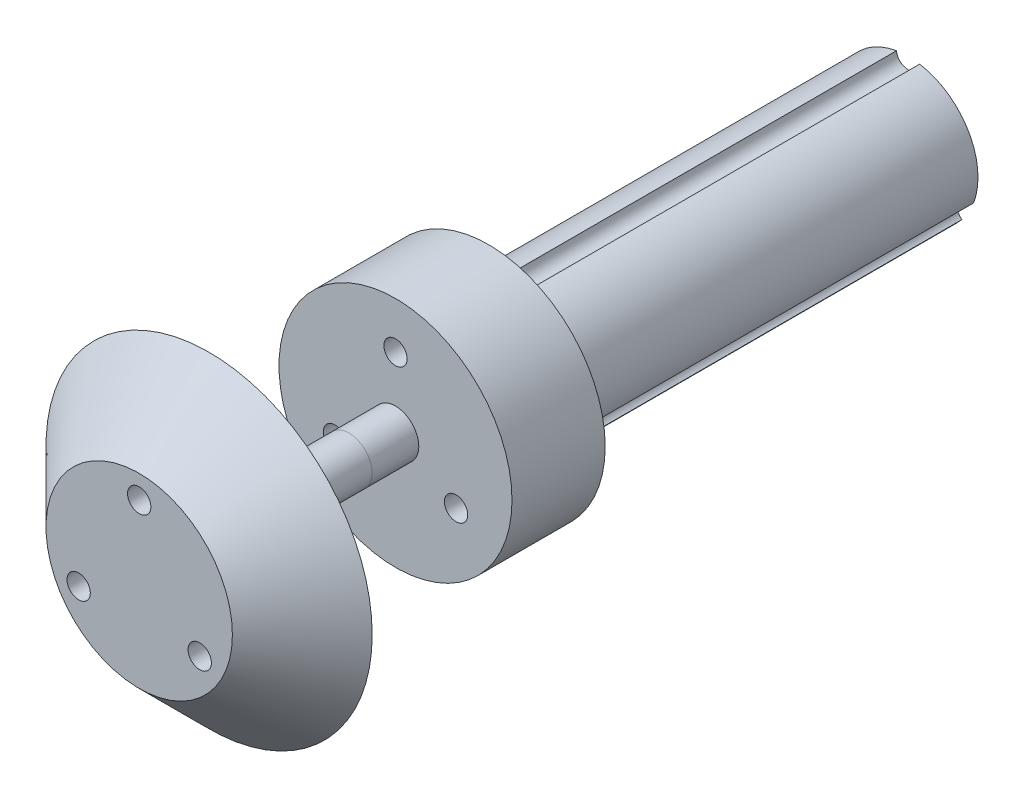
ISO-10303-21;
HEADER;
FILE_DESCRIPTION(('STEP AP214'),'2;1');
FILE_NAME('part.step','',(''),(''),'','','');
FILE_SCHEMA(('AUTOMOTIVE_DESIGN { 1 0 10303 214 1 1 1 1 }'));
ENDSEC;
DATA;
#1=APPLICATION_CONTEXT('core data for automotive mechanical design processes');
#2=APPLICATION_PROTOCOL_DEFINITION('international standard','automotive_design',2000,#1);
#3=PRODUCT_CONTEXT('',#1,'mechanical');
#4=PRODUCT('Part','Part','',(#3));
#5=PRODUCT_RELATED_PRODUCT_CATEGORY('part','',(#4));
#6=PRODUCT_DEFINITION_FORMATION('','',#4);
#7=PRODUCT_DEFINITION_CONTEXT('part definition',#1,'design');
#8=PRODUCT_DEFINITION('design','',#6,#7);
#9=PRODUCT_DEFINITION_SHAPE('','',#8);
#10=(LENGTH_UNIT() NAMED_UNIT(*) SI_UNIT(.MILLI.,.METRE.));
#11=(NAMED_UNIT(*) PLANE_ANGLE_UNIT() SI_UNIT($,.RADIAN.));
#12=(NAMED_UNIT(*) SI_UNIT($,.STERADIAN.) SOLID_ANGLE_UNIT());
#13=UNCERTAINTY_MEASURE_WITH_UNIT(LENGTH_MEASURE(1.E-05),#10,'distance_accuracy_value','');
#14=(GEOMETRIC_REPRESENTATION_CONTEXT(3) GLOBAL_UNCERTAINTY_ASSIGNED_CONTEXT((#13)) GLOBAL_UNIT_ASSIGNED_CONTEXT((#10,
#11,#12)) REPRESENTATION_CONTEXT('',''));
#15=CARTESIAN_POINT('',(0.,0.,0.));
#16=DIRECTION('',(0.,0.,1.));
#17=DIRECTION('',(1.,0.,0.));
#18=AXIS2_PLACEMENT_3D('',#15,#16,#17);
#19=CARTESIAN_POINT('',(0.,0.,-10.25));
#20=DIRECTION('',(0.,0.,1.));
#21=DIRECTION('',(1.,0.,0.));
#22=AXIS2_PLACEMENT_3D('',#19,#20,#21);
#23=CYLINDRICAL_SURFACE('',#22,1.5);
#24=DIRECTION('',(0.,0.,1.));
#25=VECTOR('',#24,1.);
#26=CARTESIAN_POINT('',(-0.249130432147946,1.47916666666667,-2.));
#27=LINE('',#26,#25);
#28=CARTESIAN_POINT('',(-0.249130432147946,1.47916666666667,-10.25));
#29=VERTEX_POINT('',#28);
#30=CARTESIAN_POINT('',(-0.249130432147946,1.47916666666667,-1.25));
#31=VERTEX_POINT('',#30);
#32=EDGE_CURVE('E149',#29,#31,#27,.T.);
#33=ORIENTED_EDGE('',*,*,#32,.F.);
#34=CARTESIAN_POINT('',(0.,0.,-10.25));
#35=DIRECTION('',(0.,0.,1.));
#36=DIRECTION('',(1.,0.,0.));
#37=AXIS2_PLACEMENT_3D('',#34,#35,#36);
#38=CIRCLE('',#37,1.5);
#39=CARTESIAN_POINT('',(-1.40556112583843,-0.523830050237488,-10.25));
#40=VERTEX_POINT('',#39);
#41=EDGE_CURVE('E122',#29,#40,#38,.T.);
#42=ORIENTED_EDGE('',*,*,#41,.T.);
#43=DIRECTION('',(0.,0.,1.));
#44=VECTOR('',#43,1.);
#45=CARTESIAN_POINT('',(-1.40556112583843,-0.523830050237488,-2.));
#46=LINE('',#45,#44);
#47=CARTESIAN_POINT('',(-1.40556112583843,-0.523830050237487,-1.25));
#48=VERTEX_POINT('',#47);
#49=EDGE_CURVE('E75',#48,#40,#46,.F.);
#50=ORIENTED_EDGE('',*,*,#49,.F.);
#51=CARTESIAN_POINT('',(0.,0.,-1.25));
#52=DIRECTION('',(0.,0.,1.));
#53=DIRECTION('',(1.,0.,0.));
#54=AXIS2_PLACEMENT_3D('',#51,#52,#53);
#55=CIRCLE('',#54,1.5);
#56=EDGE_CURVE('E134',#31,#48,#55,.T.);
#57=ORIENTED_EDGE('',*,*,#56,.F.);
#58=EDGE_LOOP('',(#33,#42,#50,#57));
#59=FACE_BOUND('',#58,.T.);
#60=ADVANCED_FACE('F51',(#59),#23,.T.);
#61=DIRECTION('',(0.,0.,1.));
#62=VECTOR('',#61,1.);
#63=CARTESIAN_POINT('',(0.249130432147946,1.47916666666667,-2.));
#64=LINE('',#63,#62);
#65=CARTESIAN_POINT('',(0.249130432147946,1.47916666666667,-1.25));
#66=VERTEX_POINT('',#65);
#67=CARTESIAN_POINT('',(0.249130432147946,1.47916666666667,-10.25));
#68=VERTEX_POINT('',#67);
#69=EDGE_CURVE('E167',#66,#68,#64,.F.);
#70=ORIENTED_EDGE('',*,*,#69,.F.);
#71=CARTESIAN_POINT('',(1.40556112583848,-0.523830050237345,-1.25));
#72=VERTEX_POINT('',#71);
#73=EDGE_CURVE('E125',#72,#66,#55,.T.);
#74=ORIENTED_EDGE('',*,*,#73,.F.);
#75=DIRECTION('',(0.,0.,1.));
#76=VECTOR('',#75,1.);
#77=CARTESIAN_POINT('',(1.40556112583848,-0.523830050237346,-2.));
#78=LINE('',#77,#76);
#79=CARTESIAN_POINT('',(1.40556112583848,-0.523830050237346,-10.25));
#80=VERTEX_POINT('',#79);
#81=EDGE_CURVE('E162',#80,#72,#78,.T.);
#82=ORIENTED_EDGE('',*,*,#81,.F.);
#83=EDGE_CURVE('E123',#80,#68,#38,.T.);
#84=ORIENTED_EDGE('',*,*,#83,.T.);
#85=EDGE_LOOP('',(#70,#74,#82,#84));
#86=FACE_BOUND('',#85,.T.);
#87=ADVANCED_FACE('F187',(#86),#23,.T.);
#88=CARTESIAN_POINT('',(0.,0.,0.749999999999998));
#89=DIRECTION('',(0.,0.,-1.));
#90=DIRECTION('',(-1.,0.,0.));
#91=AXIS2_PLACEMENT_3D('',#88,#89,#90);
#92=CYLINDRICAL_SURFACE('',#91,2.50000000000012);
#93=CARTESIAN_POINT('',(0.,0.,0.749999999999998));
#94=DIRECTION('',(0.,0.,1.));
#95=DIRECTION('',(1.,0.,0.));
#96=AXIS2_PLACEMENT_3D('',#93,#94,#95);
#97=CIRCLE('',#96,2.50000000000012);
#98=CARTESIAN_POINT('',(2.50000000000012,0.,0.749999999999998));
#99=VERTEX_POINT('',#98);
#100=EDGE_CURVE('E60',#99,#99,#97,.T.);
#101=ORIENTED_EDGE('',*,*,#100,.F.);
#102=EDGE_LOOP('',(#101));
#103=FACE_BOUND('',#102,.T.);
#104=CARTESIAN_POINT('',(0.,0.,-1.25));
#105=DIRECTION('',(0.,0.,1.));
#106=DIRECTION('',(1.,0.,0.));
#107=AXIS2_PLACEMENT_3D('',#104,#105,#106);
#108=CIRCLE('',#107,2.50000000000012);
#109=CARTESIAN_POINT('',(2.50000000000012,0.,-1.25));
#110=VERTEX_POINT('',#109);
#111=EDGE_CURVE('E131',#110,#110,#108,.T.);
#112=ORIENTED_EDGE('',*,*,#111,.T.);
#113=EDGE_LOOP('',(#112));
#114=FACE_BOUND('',#113,.T.);
#115=ADVANCED_FACE('F53',(#103,#114),#92,.T.);
#116=CARTESIAN_POINT('',(0.,0.,0.749999999999998));
#117=DIRECTION('',(0.,0.,1.));
#118=DIRECTION('',(1.,0.,0.));
#119=AXIS2_PLACEMENT_3D('',#116,#117,#118);
#120=PLANE('',#119);
#121=CARTESIAN_POINT('',(0.,0.,0.749999999999999));
#122=DIRECTION('',(0.,0.,1.));
#123=DIRECTION('',(1.,0.,0.));
#124=AXIS2_PLACEMENT_3D('',#121,#122,#123);
#125=CIRCLE('',#124,0.5);
#126=CARTESIAN_POINT('',(0.5,0.,0.749999999999999));
#127=VERTEX_POINT('',#126);
#128=EDGE_CURVE('E55',#127,#127,#125,.F.);
#129=ORIENTED_EDGE('',*,*,#128,.T.);
#130=EDGE_LOOP('',(#129));
#131=FACE_BOUND('',#130,.T.);
#132=CARTESIAN_POINT('',(0.,1.5,0.749999999999999));
#133=DIRECTION('',(0.,0.,1.));
#134=DIRECTION('',(1.,0.,0.));
#135=AXIS2_PLACEMENT_3D('',#132,#133,#134);
#136=CIRCLE('',#135,0.25);
#137=CARTESIAN_POINT('',(0.25,1.5,0.749999999999999));
#138=VERTEX_POINT('',#137);
#139=EDGE_CURVE('E127',#138,#138,#136,.T.);
#140=ORIENTED_EDGE('',*,*,#139,.F.);
#141=EDGE_LOOP('',(#140));
#142=FACE_BOUND('',#141,.T.);
#143=CARTESIAN_POINT('',(1.29903810567674,-0.749999999999954,0.749999999999999));
#144=DIRECTION('',(0.,0.,1.));
#145=DIRECTION('',(1.,0.,0.));
#146=AXIS2_PLACEMENT_3D('',#143,#144,#145);
#147=CIRCLE('',#146,0.25);
#148=CARTESIAN_POINT('',(1.54903810567674,-0.749999999999954,0.749999999999999));
#149=VERTEX_POINT('',#148);
#150=EDGE_CURVE('E164',#149,#149,#147,.T.);
#151=ORIENTED_EDGE('',*,*,#150,.F.);
#152=EDGE_LOOP('',(#151));
#153=FACE_BOUND('',#152,.T.);
#154=CARTESIAN_POINT('',(-1.29903810567658,-0.750000000000046,0.749999999999999));
#155=DIRECTION('',(0.,0.,1.));
#156=DIRECTION('',(1.,0.,0.));
#157=AXIS2_PLACEMENT_3D('',#154,#155,#156);
#158=CIRCLE('',#157,0.25);
#159=CARTESIAN_POINT('',(-1.04903810567658,-0.750000000000046,0.749999999999999));
#160=VERTEX_POINT('',#159);
#161=EDGE_CURVE('E116',#160,#160,#158,.T.);
#162=ORIENTED_EDGE('',*,*,#161,.F.);
#163=EDGE_LOOP('',(#162));
#164=FACE_BOUND('',#163,.T.);
#165=ORIENTED_EDGE('',*,*,#100,.T.);
#166=EDGE_LOOP('',(#165));
#167=FACE_BOUND('',#166,.T.);
#168=ADVANCED_FACE('F175',(#131,#142,#153,#164,#167),#120,.T.);
#169=CARTESIAN_POINT('',(0.,0.,-1.25));
#170=DIRECTION('',(0.,0.,1.));
#171=DIRECTION('',(1.,0.,0.));
#172=AXIS2_PLACEMENT_3D('',#169,#170,#171);
#173=PLANE('',#172);
#174=ORIENTED_EDGE('',*,*,#73,.T.);
#175=CARTESIAN_POINT('',(0.,1.5,-1.25));
#176=DIRECTION('',(0.,0.,1.));
#177=DIRECTION('',(1.,0.,0.));
#178=AXIS2_PLACEMENT_3D('',#175,#176,#177);
#179=CIRCLE('',#178,0.25);
#180=EDGE_CURVE('E146',#66,#31,#179,.T.);
#181=ORIENTED_EDGE('',*,*,#180,.T.);
#182=ORIENTED_EDGE('',*,*,#56,.T.);
#183=CARTESIAN_POINT('',(-1.29903810567658,-0.750000000000046,-1.25));
#184=DIRECTION('',(0.,0.,1.));
#185=DIRECTION('',(1.,0.,0.));
#186=AXIS2_PLACEMENT_3D('',#183,#184,#185);
#187=CIRCLE('',#186,0.25);
#188=CARTESIAN_POINT('',(-1.15643069369046,-0.955336616429313,-1.25));
#189=VERTEX_POINT('',#188);
#190=EDGE_CURVE('E117',#48,#189,#187,.T.);
#191=ORIENTED_EDGE('',*,*,#190,.T.);
#192=CARTESIAN_POINT('',(1.15643069369056,-0.955336616429186,-1.25));
#193=VERTEX_POINT('',#192);
#194=EDGE_CURVE('E115',#189,#193,#55,.T.);
#195=ORIENTED_EDGE('',*,*,#194,.T.);
#196=CARTESIAN_POINT('',(1.29903810567674,-0.749999999999954,-1.25));
#197=DIRECTION('',(0.,0.,1.));
#198=DIRECTION('',(1.,0.,0.));
#199=AXIS2_PLACEMENT_3D('',#196,#197,#198);
#200=CIRCLE('',#199,0.25);
#201=EDGE_CURVE('E160',#193,#72,#200,.T.);
#202=ORIENTED_EDGE('',*,*,#201,.T.);
#203=EDGE_LOOP('',(#174,#181,#182,#191,#195,#202));
#204=FACE_BOUND('',#203,.T.);
#205=ORIENTED_EDGE('',*,*,#111,.F.);
#206=EDGE_LOOP('',(#205));
#207=FACE_BOUND('',#206,.T.);
#208=ADVANCED_FACE('F144',(#204,#207),#173,.F.);
#209=DIRECTION('',(0.,0.,1.));
#210=VECTOR('',#209,1.);
#211=CARTESIAN_POINT('',(1.15643069369056,-0.955336616429185,-2.));
#212=LINE('',#211,#210);
#213=CARTESIAN_POINT('',(1.15643069369056,-0.955336616429186,-10.25));
#214=VERTEX_POINT('',#213);
#215=EDGE_CURVE('E67',#193,#214,#212,.F.);
#216=ORIENTED_EDGE('',*,*,#215,.F.);
#217=ORIENTED_EDGE('',*,*,#194,.F.);
#218=DIRECTION('',(0.,0.,1.));
#219=VECTOR('',#218,1.);
#220=CARTESIAN_POINT('',(-1.15643069369046,-0.955336616429314,-2.));
#221=LINE('',#220,#219);
#222=CARTESIAN_POINT('',(-1.15643069369046,-0.955336616429314,-10.25));
#223=VERTEX_POINT('',#222);
#224=EDGE_CURVE('E103',#223,#189,#221,.T.);
#225=ORIENTED_EDGE('',*,*,#224,.F.);
#226=EDGE_CURVE('E113',#223,#214,#38,.T.);
#227=ORIENTED_EDGE('',*,*,#226,.T.);
#228=EDGE_LOOP('',(#216,#217,#225,#227));
#229=FACE_BOUND('',#228,.T.);
#230=ADVANCED_FACE('F112',(#229),#23,.T.);
#231=CARTESIAN_POINT('',(0.,0.,-10.25));
#232=DIRECTION('',(0.,0.,1.));
#233=DIRECTION('',(1.,0.,0.));
#234=AXIS2_PLACEMENT_3D('',#231,#232,#233);
#235=PLANE('',#234);
#236=ORIENTED_EDGE('',*,*,#41,.F.);
#237=CARTESIAN_POINT('',(0.,1.5,-10.25));
#238=DIRECTION('',(0.,0.,1.));
#239=DIRECTION('',(1.,0.,0.));
#240=AXIS2_PLACEMENT_3D('',#237,#238,#239);
#241=CIRCLE('',#240,0.25);
#242=EDGE_CURVE('E150',#29,#68,#241,.T.);
#243=ORIENTED_EDGE('',*,*,#242,.T.);
#244=ORIENTED_EDGE('',*,*,#83,.F.);
#245=CARTESIAN_POINT('',(1.29903810567674,-0.749999999999954,-10.25));
#246=DIRECTION('',(0.,0.,1.));
#247=DIRECTION('',(1.,0.,0.));
#248=AXIS2_PLACEMENT_3D('',#245,#246,#247);
#249=CIRCLE('',#248,0.25);
#250=EDGE_CURVE('E121',#80,#214,#249,.T.);
#251=ORIENTED_EDGE('',*,*,#250,.T.);
#252=ORIENTED_EDGE('',*,*,#226,.F.);
#253=CARTESIAN_POINT('',(-1.29903810567658,-0.750000000000046,-10.25));
#254=DIRECTION('',(0.,0.,1.));
#255=DIRECTION('',(1.,0.,0.));
#256=AXIS2_PLACEMENT_3D('',#253,#254,#255);
#257=CIRCLE('',#256,0.25);
#258=EDGE_CURVE('E12',#223,#40,#257,.T.);
#259=ORIENTED_EDGE('',*,*,#258,.T.);
#260=EDGE_LOOP('',(#236,#243,#244,#251,#252,#259));
#261=FACE_BOUND('',#260,.T.);
#262=ADVANCED_FACE('F119',(#261),#235,.F.);
#263=CARTESIAN_POINT('',(-1.29903810567658,-0.750000000000046,-10.25));
#264=DIRECTION('',(0.,0.,1.));
#265=DIRECTION('',(1.,0.,0.));
#266=AXIS2_PLACEMENT_3D('',#263,#264,#265);
#267=CYLINDRICAL_SURFACE('',#266,0.25);
#268=ORIENTED_EDGE('',*,*,#161,.T.);
#269=EDGE_LOOP('',(#268));
#270=FACE_BOUND('',#269,.T.);
#271=ORIENTED_EDGE('',*,*,#224,.T.);
#272=ORIENTED_EDGE('',*,*,#190,.F.);
#273=ORIENTED_EDGE('',*,*,#49,.T.);
#274=ORIENTED_EDGE('',*,*,#258,.F.);
#275=EDGE_LOOP('',(#271,#272,#273,#274));
#276=FACE_BOUND('',#275,.T.);
#277=ADVANCED_FACE('F102',(#270,#276),#267,.F.);
#278=CARTESIAN_POINT('',(1.29903810567674,-0.749999999999954,-10.25));
#279=DIRECTION('',(0.,0.,1.));
#280=DIRECTION('',(1.,0.,0.));
#281=AXIS2_PLACEMENT_3D('',#278,#279,#280);
#282=CYLINDRICAL_SURFACE('',#281,0.25);
#283=ORIENTED_EDGE('',*,*,#150,.T.);
#284=EDGE_LOOP('',(#283));
#285=FACE_BOUND('',#284,.T.);
#286=ORIENTED_EDGE('',*,*,#81,.T.);
#287=ORIENTED_EDGE('',*,*,#201,.F.);
#288=ORIENTED_EDGE('',*,*,#215,.T.);
#289=ORIENTED_EDGE('',*,*,#250,.F.);
#290=EDGE_LOOP('',(#286,#287,#288,#289));
#291=FACE_BOUND('',#290,.T.);
#292=ADVANCED_FACE('F206',(#285,#291),#282,.F.);
#293=CARTESIAN_POINT('',(0.,1.5,-10.25));
#294=DIRECTION('',(0.,0.,1.));
#295=DIRECTION('',(1.,0.,0.));
#296=AXIS2_PLACEMENT_3D('',#293,#294,#295);
#297=CYLINDRICAL_SURFACE('',#296,0.25);
#298=ORIENTED_EDGE('',*,*,#139,.T.);
#299=EDGE_LOOP('',(#298));
#300=FACE_BOUND('',#299,.T.);
#301=ORIENTED_EDGE('',*,*,#32,.T.);
#302=ORIENTED_EDGE('',*,*,#180,.F.);
#303=ORIENTED_EDGE('',*,*,#69,.T.);
#304=ORIENTED_EDGE('',*,*,#242,.F.);
#305=EDGE_LOOP('',(#301,#302,#303,#304));
#306=FACE_BOUND('',#305,.T.);
#307=ADVANCED_FACE('F173',(#300,#306),#297,.F.);
#308=CARTESIAN_POINT('',(0.,0.,-8.25));
#309=DIRECTION('',(0.,0.,1.));
#310=DIRECTION('',(1.,0.,0.));
#311=AXIS2_PLACEMENT_3D('',#308,#309,#310);
#312=CYLINDRICAL_SURFACE('',#311,0.5);
#313=ORIENTED_EDGE('',*,*,#128,.F.);
#314=EDGE_LOOP('',(#313));
#315=FACE_BOUND('',#314,.T.);
#316=CARTESIAN_POINT('',(0.,0.,1.75));
#317=DIRECTION('',(0.,0.,-1.));
#318=DIRECTION('',(-1.,0.,0.));
#319=AXIS2_PLACEMENT_3D('',#316,#317,#318);
#320=CIRCLE('',#319,0.5);
#321=CARTESIAN_POINT('',(-0.5,0.,1.75));
#322=VERTEX_POINT('',#321);
#323=EDGE_CURVE('E224',#322,#322,#320,.T.);
#324=ORIENTED_EDGE('',*,*,#323,.T.);
#325=EDGE_LOOP('',(#324));
#326=FACE_BOUND('',#325,.T.);
#327=ADVANCED_FACE('F213',(#315,#326),#312,.T.);
#328=CARTESIAN_POINT('',(0.,0.,1.75));
#329=DIRECTION('',(0.,0.,-1.));
#330=DIRECTION('',(-1.,0.,0.));
#331=AXIS2_PLACEMENT_3D('',#328,#329,#330);
#332=PLANE('',#331);
#333=ORIENTED_EDGE('',*,*,#323,.F.);
#334=EDGE_LOOP('',(#333));
#335=FACE_BOUND('',#334,.T.);
#336=ADVANCED_FACE('F216',(#335),#332,.F.);
#337=CLOSED_SHELL('',(#60,#87,#115,#168,#208,#230,#262,#277,#292,#307,#327,#336));
#338=MANIFOLD_SOLID_BREP('B2',#337);
#339=CARTESIAN_POINT('',(0.,0.,4.75));
#340=DIRECTION('',(0.,0.,-1.));
#341=DIRECTION('',(1.,0.,0.));
#342=AXIS2_PLACEMENT_3D('',#339,#340,#341);
#343=PLANE('',#342);
#344=CARTESIAN_POINT('',(0.,1.5,4.75));
#345=DIRECTION('',(0.,0.,-1.));
#346=DIRECTION('',(-1.,0.,0.));
#347=AXIS2_PLACEMENT_3D('',#344,#345,#346);
#348=CIRCLE('',#347,0.25);
#349=CARTESIAN_POINT('',(-0.25,1.5,4.75));
#350=VERTEX_POINT('',#349);
#351=EDGE_CURVE('E318',#350,#350,#348,.T.);
#352=ORIENTED_EDGE('',*,*,#351,.F.);
#353=EDGE_LOOP('',(#352));
#354=FACE_BOUND('',#353,.T.);
#355=CARTESIAN_POINT('',(1.29903810567674,-0.749999999999954,4.75));
#356=DIRECTION('',(0.,0.,-1.));
#357=DIRECTION('',(-1.,0.,0.));
#358=AXIS2_PLACEMENT_3D('',#355,#356,#357);
#359=CIRCLE('',#358,0.25);
#360=CARTESIAN_POINT('',(1.04903810567674,-0.749999999999954,4.75));
#361=VERTEX_POINT('',#360);
#362=EDGE_CURVE('E321',#361,#361,#359,.T.);
#363=ORIENTED_EDGE('',*,*,#362,.F.);
#364=EDGE_LOOP('',(#363));
#365=FACE_BOUND('',#364,.T.);
#366=CARTESIAN_POINT('',(-1.29903810567658,-0.750000000000046,4.75));
#367=DIRECTION('',(0.,0.,-1.));
#368=DIRECTION('',(-1.,0.,0.));
#369=AXIS2_PLACEMENT_3D('',#366,#367,#368);
#370=CIRCLE('',#369,0.25);
#371=CARTESIAN_POINT('',(-1.54903810567658,-0.750000000000046,4.75));
#372=VERTEX_POINT('',#371);
#373=EDGE_CURVE('E324',#372,#372,#370,.T.);
#374=ORIENTED_EDGE('',*,*,#373,.F.);
#375=EDGE_LOOP('',(#374));
#376=FACE_BOUND('',#375,.T.);
#377=CARTESIAN_POINT('',(0.,0.,4.75));
#378=DIRECTION('',(0.,0.,-1.));
#379=DIRECTION('',(-1.,0.,0.));
#380=AXIS2_PLACEMENT_3D('',#377,#378,#379);
#381=CIRCLE('',#380,0.5);
#382=CARTESIAN_POINT('',(-0.5,0.,4.75));
#383=VERTEX_POINT('',#382);
#384=EDGE_CURVE('E50',#383,#383,#381,.T.);
#385=ORIENTED_EDGE('',*,*,#384,.F.);
#386=EDGE_LOOP('',(#385));
#387=FACE_BOUND('',#386,.T.);
#388=CARTESIAN_POINT('',(0.,0.,4.75));
#389=DIRECTION('',(0.,0.,1.));
#390=DIRECTION('',(1.,0.,0.));
#391=AXIS2_PLACEMENT_3D('',#388,#389,#390);
#392=CIRCLE('',#391,3.50000000000012);
#393=CARTESIAN_POINT('',(3.50000000000012,0.,4.75));
#394=VERTEX_POINT('',#393);
#395=EDGE_CURVE('E313',#394,#394,#392,.T.);
#396=ORIENTED_EDGE('',*,*,#395,.F.);
#397=EDGE_LOOP('',(#396));
#398=FACE_BOUND('',#397,.T.);
#399=ADVANCED_FACE('F299',(#354,#365,#376,#387,#398),#343,.T.);
#400=CARTESIAN_POINT('',(0.,0.,6.25));
#401=DIRECTION('',(0.,0.,-1.));
#402=DIRECTION('',(-1.,0.,0.));
#403=AXIS2_PLACEMENT_3D('',#400,#401,#402);
#404=CYLINDRICAL_SURFACE('',#403,0.5);
#405=ORIENTED_EDGE('',*,*,#384,.T.);
#406=EDGE_LOOP('',(#405));
#407=FACE_BOUND('',#406,.T.);
#408=CARTESIAN_POINT('',(0.,0.,1.75));
#409=DIRECTION('',(0.,0.,1.));
#410=DIRECTION('',(1.,0.,0.));
#411=AXIS2_PLACEMENT_3D('',#408,#409,#410);
#412=CIRCLE('',#411,0.5);
#413=CARTESIAN_POINT('',(0.5,0.,1.75));
#414=VERTEX_POINT('',#413);
#415=EDGE_CURVE('E305',#414,#414,#412,.T.);
#416=ORIENTED_EDGE('',*,*,#415,.T.);
#417=EDGE_LOOP('',(#416));
#418=FACE_BOUND('',#417,.T.);
#419=ADVANCED_FACE('F359',(#407,#418),#404,.T.);
#420=CARTESIAN_POINT('',(0.,0.,1.75));
#421=DIRECTION('',(0.,0.,1.));
#422=DIRECTION('',(1.,0.,0.));
#423=AXIS2_PLACEMENT_3D('',#420,#421,#422);
#424=PLANE('',#423);
#425=ORIENTED_EDGE('',*,*,#415,.F.);
#426=EDGE_LOOP('',(#425));
#427=FACE_BOUND('',#426,.T.);
#428=ADVANCED_FACE('F351',(#427),#424,.F.);
#429=CARTESIAN_POINT('',(0.,0.,6.25));
#430=DIRECTION('',(0.,0.,-1.));
#431=DIRECTION('',(-1.,0.,0.));
#432=AXIS2_PLACEMENT_3D('',#429,#430,#431);
#433=CONICAL_SURFACE('',#432,2.00000000000014,0.785398163397443);
#434=ORIENTED_EDGE('',*,*,#395,.T.);
#435=EDGE_LOOP('',(#434));
#436=FACE_BOUND('',#435,.T.);
#437=CARTESIAN_POINT('',(0.,0.,6.25));
#438=DIRECTION('',(0.,0.,1.));
#439=DIRECTION('',(1.,0.,0.));
#440=AXIS2_PLACEMENT_3D('',#437,#438,#439);
#441=CIRCLE('',#440,2.00000000000014);
#442=CARTESIAN_POINT('',(2.00000000000014,0.,6.25));
#443=VERTEX_POINT('',#442);
#444=EDGE_CURVE('E309',#443,#443,#441,.T.);
#445=ORIENTED_EDGE('',*,*,#444,.F.);
#446=EDGE_LOOP('',(#445));
#447=FACE_BOUND('',#446,.T.);
#448=ADVANCED_FACE('F343',(#436,#447),#433,.T.);
#449=CARTESIAN_POINT('',(0.,0.,6.25));
#450=DIRECTION('',(0.,0.,-1.));
#451=DIRECTION('',(1.,0.,0.));
#452=AXIS2_PLACEMENT_3D('',#449,#450,#451);
#453=PLANE('',#452);
#454=CARTESIAN_POINT('',(0.,1.5,6.25));
#455=DIRECTION('',(0.,0.,1.));
#456=DIRECTION('',(1.,0.,0.));
#457=AXIS2_PLACEMENT_3D('',#454,#455,#456);
#458=CIRCLE('',#457,0.25);
#459=CARTESIAN_POINT('',(0.25,1.5,6.25));
#460=VERTEX_POINT('',#459);
#461=EDGE_CURVE('E327',#460,#460,#458,.T.);
#462=ORIENTED_EDGE('',*,*,#461,.F.);
#463=EDGE_LOOP('',(#462));
#464=FACE_BOUND('',#463,.T.);
#465=CARTESIAN_POINT('',(1.29903810567674,-0.749999999999954,6.25));
#466=DIRECTION('',(0.,0.,1.));
#467=DIRECTION('',(1.,0.,0.));
#468=AXIS2_PLACEMENT_3D('',#465,#466,#467);
#469=CIRCLE('',#468,0.25);
#470=CARTESIAN_POINT('',(1.54903810567674,-0.749999999999954,6.25));
#471=VERTEX_POINT('',#470);
#472=EDGE_CURVE('E331',#471,#471,#469,.T.);
#473=ORIENTED_EDGE('',*,*,#472,.F.);
#474=EDGE_LOOP('',(#473));
#475=FACE_BOUND('',#474,.T.);
#476=CARTESIAN_POINT('',(-1.29903810567658,-0.750000000000046,6.25));
#477=DIRECTION('',(0.,0.,1.));
#478=DIRECTION('',(1.,0.,0.));
#479=AXIS2_PLACEMENT_3D('',#476,#477,#478);
#480=CIRCLE('',#479,0.25);
#481=CARTESIAN_POINT('',(-1.04903810567658,-0.750000000000046,6.25));
#482=VERTEX_POINT('',#481);
#483=EDGE_CURVE('E328',#482,#482,#480,.T.);
#484=ORIENTED_EDGE('',*,*,#483,.F.);
#485=EDGE_LOOP('',(#484));
#486=FACE_BOUND('',#485,.T.);
#487=ORIENTED_EDGE('',*,*,#444,.T.);
#488=EDGE_LOOP('',(#487));
#489=FACE_BOUND('',#488,.T.);
#490=ADVANCED_FACE('F339',(#464,#475,#486,#489),#453,.F.);
#491=CARTESIAN_POINT('',(-1.29903810567658,-0.750000000000046,-10.25));
#492=DIRECTION('',(0.,0.,1.));
#493=DIRECTION('',(1.,0.,0.));
#494=AXIS2_PLACEMENT_3D('',#491,#492,#493);
#495=CYLINDRICAL_SURFACE('',#494,0.25);
#496=ORIENTED_EDGE('',*,*,#373,.T.);
#497=EDGE_LOOP('',(#496));
#498=FACE_BOUND('',#497,.T.);
#499=ORIENTED_EDGE('',*,*,#483,.T.);
#500=EDGE_LOOP('',(#499));
#501=FACE_BOUND('',#500,.T.);
#502=ADVANCED_FACE('F342',(#498,#501),#495,.F.);
#503=CARTESIAN_POINT('',(1.29903810567674,-0.749999999999954,-10.25));
#504=DIRECTION('',(0.,0.,1.));
#505=DIRECTION('',(1.,0.,0.));
#506=AXIS2_PLACEMENT_3D('',#503,#504,#505);
#507=CYLINDRICAL_SURFACE('',#506,0.25);
#508=ORIENTED_EDGE('',*,*,#362,.T.);
#509=EDGE_LOOP('',(#508));
#510=FACE_BOUND('',#509,.T.);
#511=ORIENTED_EDGE('',*,*,#472,.T.);
#512=EDGE_LOOP('',(#511));
#513=FACE_BOUND('',#512,.T.);
#514=ADVANCED_FACE('F379',(#510,#513),#507,.F.);
#515=CARTESIAN_POINT('',(0.,1.5,-10.25));
#516=DIRECTION('',(0.,0.,1.));
#517=DIRECTION('',(1.,0.,0.));
#518=AXIS2_PLACEMENT_3D('',#515,#516,#517);
#519=CYLINDRICAL_SURFACE('',#518,0.25);
#520=ORIENTED_EDGE('',*,*,#351,.T.);
#521=EDGE_LOOP('',(#520));
#522=FACE_BOUND('',#521,.T.);
#523=ORIENTED_EDGE('',*,*,#461,.T.);
#524=EDGE_LOOP('',(#523));
#525=FACE_BOUND('',#524,.T.);
#526=ADVANCED_FACE('F337',(#522,#525),#519,.F.);
#527=CLOSED_SHELL('',(#399,#419,#428,#448,#490,#502,#514,#526));
#528=MANIFOLD_SOLID_BREP('B6',#527);
#529=ADVANCED_BREP_SHAPE_REPRESENTATION('',(#18,#338,#528),#14);
#530=SHAPE_DEFINITION_REPRESENTATION(#9,#529);
ENDSEC;
END-ISO-10303-21;
